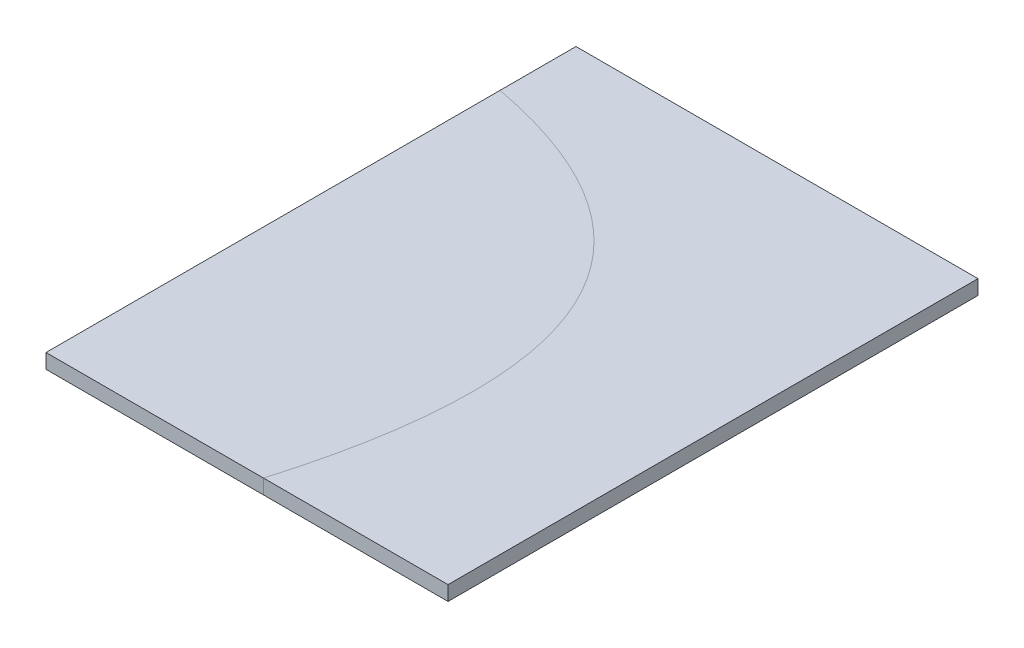
ISO-10303-21;
HEADER;
FILE_DESCRIPTION(('STEP AP214'),'2;1');
FILE_NAME('part.step','',(''),(''),'','','');
FILE_SCHEMA(('AUTOMOTIVE_DESIGN { 1 0 10303 214 1 1 1 1 }'));
ENDSEC;
DATA;
#1=APPLICATION_CONTEXT('core data for automotive mechanical design processes');
#2=APPLICATION_PROTOCOL_DEFINITION('international standard','automotive_design',2000,#1);
#3=PRODUCT_CONTEXT('',#1,'mechanical');
#4=PRODUCT('Part','Part','',(#3));
#5=PRODUCT_RELATED_PRODUCT_CATEGORY('part','',(#4));
#6=PRODUCT_DEFINITION_FORMATION('','',#4);
#7=PRODUCT_DEFINITION_CONTEXT('part definition',#1,'design');
#8=PRODUCT_DEFINITION('design','',#6,#7);
#9=PRODUCT_DEFINITION_SHAPE('','',#8);
#10=(LENGTH_UNIT() NAMED_UNIT(*) SI_UNIT(.MILLI.,.METRE.));
#11=(NAMED_UNIT(*) PLANE_ANGLE_UNIT() SI_UNIT($,.RADIAN.));
#12=(NAMED_UNIT(*) SI_UNIT($,.STERADIAN.) SOLID_ANGLE_UNIT());
#13=UNCERTAINTY_MEASURE_WITH_UNIT(LENGTH_MEASURE(1.E-05),#10,'distance_accuracy_value','');
#14=(GEOMETRIC_REPRESENTATION_CONTEXT(3) GLOBAL_UNCERTAINTY_ASSIGNED_CONTEXT((#13)) GLOBAL_UNIT_ASSIGNED_CONTEXT((#10,
#11,#12)) REPRESENTATION_CONTEXT('',''));
#15=CARTESIAN_POINT('',(0.,0.,0.));
#16=DIRECTION('',(0.,0.,1.));
#17=DIRECTION('',(1.,0.,0.));
#18=AXIS2_PLACEMENT_3D('',#15,#16,#17);
#19=CARTESIAN_POINT('',(-827408.572713786,40.,562321.04319291));
#20=CARTESIAN_POINT('',(806756.823101181,40.,-591242.363153541));
#21=CARTESIAN_POINT('',(-786391.293439061,40.,618337.792150355));
#22=B_SPLINE_CURVE_WITH_KNOTS('',2,(#19,#20,#21),.UNSPECIFIED.,.F.,.F.,(3,3),(0.,1.),.UNSPECIFIED.);
#23=DIRECTION('',(0.,-1.,0.));
#24=VECTOR('',#23,1.);
#25=SURFACE_OF_LINEAR_EXTRUSION('',#22,#24);
#26=CARTESIAN_POINT('',(-827408.572713786,0.,562321.04319291));
#27=CARTESIAN_POINT('',(806756.823101181,0.,-591242.363153541));
#28=CARTESIAN_POINT('',(-786391.293439061,0.,618337.792150355));
#29=B_SPLINE_CURVE_WITH_KNOTS('',2,(#26,#27,#28),.UNSPECIFIED.,.F.,.F.,(3,3),(0.,1.),.UNSPECIFIED.);
#30=CARTESIAN_POINT('',(-617.777777777469,0.,-755.586382028772));
#31=VERTEX_POINT('',#30);
#32=CARTESIAN_POINT('',(-22.6207655898358,0.,486.666666665634));
#33=VERTEX_POINT('',#32);
#34=EDGE_CURVE('E107',#31,#33,#29,.T.);
#35=ORIENTED_EDGE('',*,*,#34,.F.);
#36=DIRECTION('',(0.,-1.,0.));
#37=VECTOR('',#36,1.);
#38=CARTESIAN_POINT('',(-617.777777777469,40.,-755.586382028772));
#39=LINE('',#38,#37);
#40=CARTESIAN_POINT('',(-617.777777777469,40.,-755.586382028772));
#41=VERTEX_POINT('',#40);
#42=EDGE_CURVE('E12',#41,#31,#39,.T.);
#43=ORIENTED_EDGE('',*,*,#42,.F.);
#44=CARTESIAN_POINT('',(-22.6207655898358,40.,486.666666665634));
#45=VERTEX_POINT('',#44);
#46=EDGE_CURVE('E94',#41,#45,#22,.T.);
#47=ORIENTED_EDGE('',*,*,#46,.T.);
#48=DIRECTION('',(0.,-1.,0.));
#49=VECTOR('',#48,1.);
#50=CARTESIAN_POINT('',(-22.6207655898358,40.,486.666666665634));
#51=LINE('',#50,#49);
#52=EDGE_CURVE('E53',#45,#33,#51,.T.);
#53=ORIENTED_EDGE('',*,*,#52,.T.);
#54=EDGE_LOOP('',(#35,#43,#47,#53));
#55=FACE_BOUND('',#54,.T.);
#56=ADVANCED_FACE('F49',(#55),#25,.T.);
#57=CARTESIAN_POINT('',(-617.777777777778,40.,486.666666666667));
#58=DIRECTION('',(-1.,0.,-2.48721521011885E-13));
#59=DIRECTION('',(-2.48721521011885E-13,0.,1.));
#60=AXIS2_PLACEMENT_3D('',#57,#58,#59);
#61=PLANE('',#60);
#62=DIRECTION('',(2.48721521011885E-13,0.,-1.));
#63=VECTOR('',#62,1.);
#64=CARTESIAN_POINT('',(-617.777777777778,0.,486.666666666667));
#65=LINE('',#64,#63);
#66=CARTESIAN_POINT('',(-617.777777777778,0.,486.666666666667));
#67=VERTEX_POINT('',#66);
#68=EDGE_CURVE('E96',#67,#31,#65,.T.);
#69=ORIENTED_EDGE('',*,*,#68,.F.);
#70=DIRECTION('',(0.,-1.,0.));
#71=VECTOR('',#70,1.);
#72=CARTESIAN_POINT('',(-617.777777777778,40.,486.666666666667));
#73=LINE('',#72,#71);
#74=CARTESIAN_POINT('',(-617.777777777778,40.,486.666666666667));
#75=VERTEX_POINT('',#74);
#76=EDGE_CURVE('E59',#75,#67,#73,.T.);
#77=ORIENTED_EDGE('',*,*,#76,.F.);
#78=DIRECTION('',(2.48721521011885E-13,0.,-1.));
#79=VECTOR('',#78,1.);
#80=CARTESIAN_POINT('',(-617.777777777778,40.,486.666666666667));
#81=LINE('',#80,#79);
#82=EDGE_CURVE('E91',#75,#41,#81,.T.);
#83=ORIENTED_EDGE('',*,*,#82,.T.);
#84=ORIENTED_EDGE('',*,*,#42,.T.);
#85=EDGE_LOOP('',(#69,#77,#83,#84));
#86=FACE_BOUND('',#85,.T.);
#87=ADVANCED_FACE('F116',(#86),#61,.T.);
#88=CARTESIAN_POINT('',(-22.6207655898358,40.,486.666666665634));
#89=DIRECTION('',(1.73438241675169E-12,0.,1.));
#90=DIRECTION('',(1.,0.,-1.73438241675169E-12));
#91=AXIS2_PLACEMENT_3D('',#88,#89,#90);
#92=PLANE('',#91);
#93=DIRECTION('',(-1.,0.,1.73438241675169E-12));
#94=VECTOR('',#93,1.);
#95=CARTESIAN_POINT('',(-22.6207655898358,0.,486.666666665634));
#96=LINE('',#95,#94);
#97=EDGE_CURVE('E89',#33,#67,#96,.T.);
#98=ORIENTED_EDGE('',*,*,#97,.F.);
#99=ORIENTED_EDGE('',*,*,#52,.F.);
#100=DIRECTION('',(-1.,0.,1.73438241675169E-12));
#101=VECTOR('',#100,1.);
#102=CARTESIAN_POINT('',(-22.6207655898358,40.,486.666666665634));
#103=LINE('',#102,#101);
#104=EDGE_CURVE('E87',#45,#75,#103,.T.);
#105=ORIENTED_EDGE('',*,*,#104,.T.);
#106=ORIENTED_EDGE('',*,*,#76,.T.);
#107=EDGE_LOOP('',(#98,#99,#105,#106));
#108=FACE_BOUND('',#107,.T.);
#109=ADVANCED_FACE('F86',(#108),#92,.T.);
#110=CARTESIAN_POINT('',(-71.5549876214538,40.,-456.472740954297));
#111=DIRECTION('',(0.,1.,0.));
#112=DIRECTION('',(0.,0.,1.));
#113=AXIS2_PLACEMENT_3D('',#110,#111,#112);
#114=PLANE('',#113);
#115=ORIENTED_EDGE('',*,*,#46,.F.);
#116=ORIENTED_EDGE('',*,*,#82,.F.);
#117=ORIENTED_EDGE('',*,*,#104,.F.);
#118=EDGE_LOOP('',(#115,#116,#117));
#119=FACE_BOUND('',#118,.T.);
#120=ADVANCED_FACE('F93',(#119),#114,.T.);
#121=CARTESIAN_POINT('',(-71.5549876214538,0.,-456.472740954297));
#122=DIRECTION('',(0.,1.,0.));
#123=DIRECTION('',(0.,0.,1.));
#124=AXIS2_PLACEMENT_3D('',#121,#122,#123);
#125=PLANE('',#124);
#126=ORIENTED_EDGE('',*,*,#34,.T.);
#127=ORIENTED_EDGE('',*,*,#97,.T.);
#128=ORIENTED_EDGE('',*,*,#68,.T.);
#129=EDGE_LOOP('',(#126,#127,#128));
#130=FACE_BOUND('',#129,.T.);
#131=ADVANCED_FACE('F115',(#130),#125,.F.);
#132=CLOSED_SHELL('',(#56,#87,#109,#120,#131));
#133=MANIFOLD_SOLID_BREP('B2',#132);
#134=CARTESIAN_POINT('',(-617.777777777778,40.,-963.333333333333));
#135=DIRECTION('',(1.,0.,0.));
#136=DIRECTION('',(0.,0.,-1.));
#137=AXIS2_PLACEMENT_3D('',#134,#135,#136);
#138=PLANE('',#137);
#139=DIRECTION('',(0.,0.,1.));
#140=VECTOR('',#139,1.);
#141=CARTESIAN_POINT('',(-617.777777777778,0.,-963.333333333333));
#142=LINE('',#141,#140);
#143=CARTESIAN_POINT('',(-617.777777777778,0.,-963.333333333333));
#144=VERTEX_POINT('',#143);
#145=CARTESIAN_POINT('',(-617.777777777778,0.,-755.586382028854));
#146=VERTEX_POINT('',#145);
#147=EDGE_CURVE('E231',#144,#146,#142,.T.);
#148=ORIENTED_EDGE('',*,*,#147,.T.);
#149=DIRECTION('',(0.,-1.,0.));
#150=VECTOR('',#149,1.);
#151=CARTESIAN_POINT('',(-617.777777777778,1020.,-755.586382028854));
#152=LINE('',#151,#150);
#153=CARTESIAN_POINT('',(-617.777777777778,40.,-755.586382028854));
#154=VERTEX_POINT('',#153);
#155=EDGE_CURVE('E172',#154,#146,#152,.T.);
#156=ORIENTED_EDGE('',*,*,#155,.F.);
#157=DIRECTION('',(0.,0.,1.));
#158=VECTOR('',#157,1.);
#159=CARTESIAN_POINT('',(-617.777777777778,40.,-963.333333333333));
#160=LINE('',#159,#158);
#161=CARTESIAN_POINT('',(-617.777777777778,40.,-963.333333333333));
#162=VERTEX_POINT('',#161);
#163=EDGE_CURVE('E242',#162,#154,#160,.T.);
#164=ORIENTED_EDGE('',*,*,#163,.F.);
#165=DIRECTION('',(0.,-1.,0.));
#166=VECTOR('',#165,1.);
#167=CARTESIAN_POINT('',(-617.777777777778,40.,-963.333333333333));
#168=LINE('',#167,#166);
#169=EDGE_CURVE('E243',#162,#144,#168,.T.);
#170=ORIENTED_EDGE('',*,*,#169,.T.);
#171=EDGE_LOOP('',(#148,#156,#164,#170));
#172=FACE_BOUND('',#171,.T.);
#173=ADVANCED_FACE('F157',(#172),#138,.F.);
#174=CARTESIAN_POINT('',(-617.777777777778,40.,486.666666666667));
#175=DIRECTION('',(0.,0.,-1.));
#176=DIRECTION('',(-1.,0.,0.));
#177=AXIS2_PLACEMENT_3D('',#174,#175,#176);
#178=PLANE('',#177);
#179=DIRECTION('',(1.,0.,0.));
#180=VECTOR('',#179,1.);
#181=CARTESIAN_POINT('',(-617.777777777778,40.,486.666666666667));
#182=LINE('',#181,#180);
#183=CARTESIAN_POINT('',(-22.6207655900743,40.,486.666666666667));
#184=VERTEX_POINT('',#183);
#185=CARTESIAN_POINT('',(482.222222222222,40.,486.666666666667));
#186=VERTEX_POINT('',#185);
#187=EDGE_CURVE('E203',#184,#186,#182,.T.);
#188=ORIENTED_EDGE('',*,*,#187,.F.);
#189=DIRECTION('',(0.,-1.,0.));
#190=VECTOR('',#189,1.);
#191=CARTESIAN_POINT('',(-22.6207655900743,1020.,486.666666666667));
#192=LINE('',#191,#190);
#193=CARTESIAN_POINT('',(-22.6207655900743,0.,486.666666666667));
#194=VERTEX_POINT('',#193);
#195=EDGE_CURVE('E214',#184,#194,#192,.T.);
#196=ORIENTED_EDGE('',*,*,#195,.T.);
#197=DIRECTION('',(1.,0.,0.));
#198=VECTOR('',#197,1.);
#199=CARTESIAN_POINT('',(-617.777777777778,0.,486.666666666667));
#200=LINE('',#199,#198);
#201=CARTESIAN_POINT('',(482.222222222222,0.,486.666666666667));
#202=VERTEX_POINT('',#201);
#203=EDGE_CURVE('E223',#194,#202,#200,.T.);
#204=ORIENTED_EDGE('',*,*,#203,.T.);
#205=DIRECTION('',(0.,-1.,0.));
#206=VECTOR('',#205,1.);
#207=CARTESIAN_POINT('',(482.222222222222,40.,486.666666666667));
#208=LINE('',#207,#206);
#209=EDGE_CURVE('E165',#186,#202,#208,.T.);
#210=ORIENTED_EDGE('',*,*,#209,.F.);
#211=EDGE_LOOP('',(#188,#196,#204,#210));
#212=FACE_BOUND('',#211,.T.);
#213=ADVANCED_FACE('F222',(#212),#178,.F.);
#214=CARTESIAN_POINT('',(482.222222222222,40.,-963.333333333333));
#215=DIRECTION('',(-1.,0.,0.));
#216=DIRECTION('',(0.,0.,1.));
#217=AXIS2_PLACEMENT_3D('',#214,#215,#216);
#218=PLANE('',#217);
#219=DIRECTION('',(0.,0.,-1.));
#220=VECTOR('',#219,1.);
#221=CARTESIAN_POINT('',(482.222222222222,0.,-963.333333333333));
#222=LINE('',#221,#220);
#223=CARTESIAN_POINT('',(482.222222222222,0.,-963.333333333333));
#224=VERTEX_POINT('',#223);
#225=EDGE_CURVE('E229',#202,#224,#222,.T.);
#226=ORIENTED_EDGE('',*,*,#225,.T.);
#227=DIRECTION('',(0.,-1.,0.));
#228=VECTOR('',#227,1.);
#229=CARTESIAN_POINT('',(482.222222222222,40.,-963.333333333333));
#230=LINE('',#229,#228);
#231=CARTESIAN_POINT('',(482.222222222222,40.,-963.333333333333));
#232=VERTEX_POINT('',#231);
#233=EDGE_CURVE('E246',#232,#224,#230,.T.);
#234=ORIENTED_EDGE('',*,*,#233,.F.);
#235=DIRECTION('',(0.,0.,-1.));
#236=VECTOR('',#235,1.);
#237=CARTESIAN_POINT('',(482.222222222222,40.,-963.333333333333));
#238=LINE('',#237,#236);
#239=EDGE_CURVE('E253',#186,#232,#238,.T.);
#240=ORIENTED_EDGE('',*,*,#239,.F.);
#241=ORIENTED_EDGE('',*,*,#209,.T.);
#242=EDGE_LOOP('',(#226,#234,#240,#241));
#243=FACE_BOUND('',#242,.T.);
#244=ADVANCED_FACE('F251',(#243),#218,.F.);
#245=CARTESIAN_POINT('',(-617.777777777778,40.,-963.333333333333));
#246=DIRECTION('',(0.,0.,1.));
#247=DIRECTION('',(1.,0.,0.));
#248=AXIS2_PLACEMENT_3D('',#245,#246,#247);
#249=PLANE('',#248);
#250=DIRECTION('',(-1.,0.,0.));
#251=VECTOR('',#250,1.);
#252=CARTESIAN_POINT('',(-617.777777777778,0.,-963.333333333333));
#253=LINE('',#252,#251);
#254=EDGE_CURVE('E198',#224,#144,#253,.T.);
#255=ORIENTED_EDGE('',*,*,#254,.T.);
#256=ORIENTED_EDGE('',*,*,#169,.F.);
#257=DIRECTION('',(-1.,0.,0.));
#258=VECTOR('',#257,1.);
#259=CARTESIAN_POINT('',(-617.777777777778,40.,-963.333333333333));
#260=LINE('',#259,#258);
#261=EDGE_CURVE('E181',#232,#162,#260,.T.);
#262=ORIENTED_EDGE('',*,*,#261,.F.);
#263=ORIENTED_EDGE('',*,*,#233,.T.);
#264=EDGE_LOOP('',(#255,#256,#262,#263));
#265=FACE_BOUND('',#264,.T.);
#266=ADVANCED_FACE('F313',(#265),#249,.F.);
#267=CARTESIAN_POINT('',(0.,40.,0.));
#268=DIRECTION('',(0.,1.,0.));
#269=DIRECTION('',(0.,0.,1.));
#270=AXIS2_PLACEMENT_3D('',#267,#268,#269);
#271=PLANE('',#270);
#272=CARTESIAN_POINT('',(-617.777777777778,40.,-755.586382028854));
#273=CARTESIAN_POINT('',(293.432590218292,40.,-583.780996803862));
#274=CARTESIAN_POINT('',(-22.6207655900743,40.,486.666666666667));
#275=B_SPLINE_CURVE_WITH_KNOTS('',2,(#272,#273,#274),.UNSPECIFIED.,.F.,.F.,(3,3),(0.,1.),.UNSPECIFIED.);
#276=EDGE_CURVE('E270',#184,#154,#275,.F.);
#277=ORIENTED_EDGE('',*,*,#276,.F.);
#278=ORIENTED_EDGE('',*,*,#187,.T.);
#279=ORIENTED_EDGE('',*,*,#239,.T.);
#280=ORIENTED_EDGE('',*,*,#261,.T.);
#281=ORIENTED_EDGE('',*,*,#163,.T.);
#282=EDGE_LOOP('',(#277,#278,#279,#280,#281));
#283=FACE_BOUND('',#282,.T.);
#284=ADVANCED_FACE('F310',(#283),#271,.T.);
#285=CARTESIAN_POINT('',(0.,0.,0.));
#286=DIRECTION('',(0.,1.,0.));
#287=DIRECTION('',(0.,0.,1.));
#288=AXIS2_PLACEMENT_3D('',#285,#286,#287);
#289=PLANE('',#288);
#290=CARTESIAN_POINT('',(217.222222222222,0.,221.666666666667));
#291=DIRECTION('',(0.,1.,0.));
#292=DIRECTION('',(0.,0.,1.));
#293=AXIS2_PLACEMENT_3D('',#290,#291,#292);
#294=CIRCLE('',#293,70.);
#295=CARTESIAN_POINT('',(217.222222222222,0.,291.666666666667));
#296=VERTEX_POINT('',#295);
#297=EDGE_CURVE('E47',#296,#296,#294,.F.);
#298=ORIENTED_EDGE('',*,*,#297,.F.);
#299=EDGE_LOOP('',(#298));
#300=FACE_BOUND('',#299,.T.);
#301=ORIENTED_EDGE('',*,*,#203,.F.);
#302=CARTESIAN_POINT('',(-617.777777777778,0.,-755.586382028854));
#303=CARTESIAN_POINT('',(293.432590218292,0.,-583.780996803862));
#304=CARTESIAN_POINT('',(-22.6207655900743,0.,486.666666666667));
#305=B_SPLINE_CURVE_WITH_KNOTS('',2,(#302,#303,#304),.UNSPECIFIED.,.F.,.F.,(3,3),(0.,1.),.UNSPECIFIED.);
#306=EDGE_CURVE('E211',#146,#194,#305,.T.);
#307=ORIENTED_EDGE('',*,*,#306,.F.);
#308=ORIENTED_EDGE('',*,*,#147,.F.);
#309=ORIENTED_EDGE('',*,*,#254,.F.);
#310=ORIENTED_EDGE('',*,*,#225,.F.);
#311=EDGE_LOOP('',(#301,#307,#308,#309,#310));
#312=FACE_BOUND('',#311,.T.);
#313=ADVANCED_FACE('F228',(#300,#312),#289,.F.);
#314=CARTESIAN_POINT('',(217.222222222222,-40.,221.666666666667));
#315=DIRECTION('',(0.,-1.,0.));
#316=DIRECTION('',(0.,0.,-1.));
#317=AXIS2_PLACEMENT_3D('',#314,#315,#316);
#318=PLANE('',#317);
#319=CARTESIAN_POINT('',(217.222222222222,-40.,221.666666666667));
#320=DIRECTION('',(0.,-1.,0.));
#321=DIRECTION('',(0.,0.,-1.));
#322=AXIS2_PLACEMENT_3D('',#319,#320,#321);
#323=CIRCLE('',#322,70.);
#324=CARTESIAN_POINT('',(217.222222222222,-40.,151.666666666667));
#325=VERTEX_POINT('',#324);
#326=EDGE_CURVE('E236',#325,#325,#323,.T.);
#327=ORIENTED_EDGE('',*,*,#326,.T.);
#328=EDGE_LOOP('',(#327));
#329=FACE_BOUND('',#328,.T.);
#330=CARTESIAN_POINT('',(217.222222222222,-40.,221.666666666667));
#331=DIRECTION('',(0.,-1.,0.));
#332=DIRECTION('',(0.,0.,-1.));
#333=AXIS2_PLACEMENT_3D('',#330,#331,#332);
#334=CIRCLE('',#333,50.);
#335=CARTESIAN_POINT('',(217.222222222222,-40.,171.666666666667));
#336=VERTEX_POINT('',#335);
#337=EDGE_CURVE('E265',#336,#336,#334,.T.);
#338=ORIENTED_EDGE('',*,*,#337,.F.);
#339=EDGE_LOOP('',(#338));
#340=FACE_BOUND('',#339,.T.);
#341=ADVANCED_FACE('F303',(#329,#340),#318,.T.);
#342=CARTESIAN_POINT('',(217.222222222222,-40.,221.666666666667));
#343=DIRECTION('',(0.,1.,0.));
#344=DIRECTION('',(0.,0.,1.));
#345=AXIS2_PLACEMENT_3D('',#342,#343,#344);
#346=CYLINDRICAL_SURFACE('',#345,70.);
#347=ORIENTED_EDGE('',*,*,#326,.F.);
#348=EDGE_LOOP('',(#347));
#349=FACE_BOUND('',#348,.T.);
#350=ORIENTED_EDGE('',*,*,#297,.T.);
#351=EDGE_LOOP('',(#350));
#352=FACE_BOUND('',#351,.T.);
#353=ADVANCED_FACE('F301',(#349,#352),#346,.T.);
#354=CARTESIAN_POINT('',(217.222222222222,-40.,221.666666666667));
#355=DIRECTION('',(0.,1.,0.));
#356=DIRECTION('',(0.,0.,1.));
#357=AXIS2_PLACEMENT_3D('',#354,#355,#356);
#358=CYLINDRICAL_SURFACE('',#357,50.);
#359=ORIENTED_EDGE('',*,*,#337,.T.);
#360=EDGE_LOOP('',(#359));
#361=FACE_BOUND('',#360,.T.);
#362=CARTESIAN_POINT('',(217.222222222222,0.,221.666666666667));
#363=DIRECTION('',(0.,-1.,0.));
#364=DIRECTION('',(0.,0.,-1.));
#365=AXIS2_PLACEMENT_3D('',#362,#363,#364);
#366=CIRCLE('',#365,50.);
#367=CARTESIAN_POINT('',(217.222222222222,0.,171.666666666667));
#368=VERTEX_POINT('',#367);
#369=EDGE_CURVE('E266',#368,#368,#366,.T.);
#370=ORIENTED_EDGE('',*,*,#369,.F.);
#371=EDGE_LOOP('',(#370));
#372=FACE_BOUND('',#371,.T.);
#373=ADVANCED_FACE('F298',(#361,#372),#358,.F.);
#374=ORIENTED_EDGE('',*,*,#369,.T.);
#375=EDGE_LOOP('',(#374));
#376=FACE_BOUND('',#375,.T.);
#377=ADVANCED_FACE('F297',(#376),#289,.F.);
#378=CARTESIAN_POINT('',(-617.777777777778,1020.,-755.586382028854));
#379=CARTESIAN_POINT('',(293.432590218292,1020.,-583.780996803862));
#380=CARTESIAN_POINT('',(-22.6207655900743,1020.,486.666666666667));
#381=B_SPLINE_CURVE_WITH_KNOTS('',2,(#378,#379,#380),.UNSPECIFIED.,.F.,.F.,(3,3),(0.,1.),.UNSPECIFIED.);
#382=DIRECTION('',(0.,-1.,0.));
#383=VECTOR('',#382,1.);
#384=SURFACE_OF_LINEAR_EXTRUSION('',#381,#383);
#385=ORIENTED_EDGE('',*,*,#276,.T.);
#386=ORIENTED_EDGE('',*,*,#155,.T.);
#387=ORIENTED_EDGE('',*,*,#306,.T.);
#388=ORIENTED_EDGE('',*,*,#195,.F.);
#389=EDGE_LOOP('',(#385,#386,#387,#388));
#390=FACE_BOUND('',#389,.T.);
#391=ADVANCED_FACE('F213',(#390),#384,.F.);
#392=CLOSED_SHELL('',(#173,#213,#244,#266,#284,#313,#341,#353,#373,#377,#391));
#393=MANIFOLD_SOLID_BREP('B6',#392);
#394=ADVANCED_BREP_SHAPE_REPRESENTATION('',(#18,#133,#393),#14);
#395=SHAPE_DEFINITION_REPRESENTATION(#9,#394);
ENDSEC;
END-ISO-10303-21;
